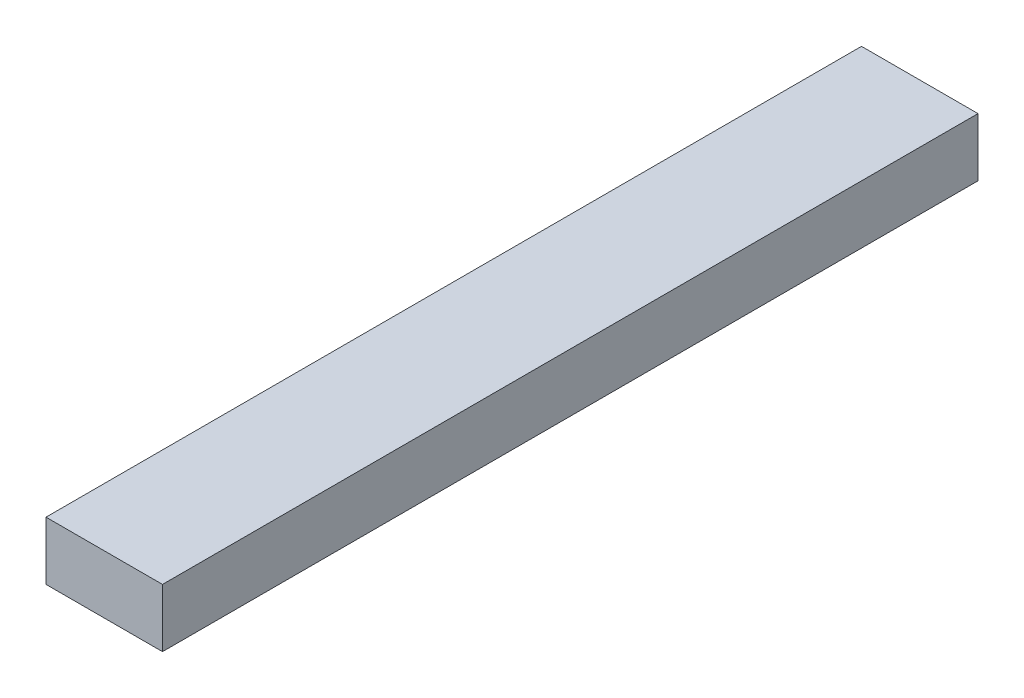
ISO-10303-21;
HEADER;
FILE_DESCRIPTION(('STEP AP214'),'2;1');
FILE_NAME('part.step','',(''),(''),'','','');
FILE_SCHEMA(('AUTOMOTIVE_DESIGN { 1 0 10303 214 1 1 1 1 }'));
ENDSEC;
DATA;
#1=APPLICATION_CONTEXT('core data for automotive mechanical design processes');
#2=APPLICATION_PROTOCOL_DEFINITION('international standard','automotive_design',2000,#1);
#3=PRODUCT_CONTEXT('',#1,'mechanical');
#4=PRODUCT('Part','Part','',(#3));
#5=PRODUCT_RELATED_PRODUCT_CATEGORY('part','',(#4));
#6=PRODUCT_DEFINITION_FORMATION('','',#4);
#7=PRODUCT_DEFINITION_CONTEXT('part definition',#1,'design');
#8=PRODUCT_DEFINITION('design','',#6,#7);
#9=PRODUCT_DEFINITION_SHAPE('','',#8);
#10=(LENGTH_UNIT() NAMED_UNIT(*) SI_UNIT(.MILLI.,.METRE.));
#11=(NAMED_UNIT(*) PLANE_ANGLE_UNIT() SI_UNIT($,.RADIAN.));
#12=(NAMED_UNIT(*) SI_UNIT($,.STERADIAN.) SOLID_ANGLE_UNIT());
#13=UNCERTAINTY_MEASURE_WITH_UNIT(LENGTH_MEASURE(1.E-05),#10,'distance_accuracy_value','');
#14=(GEOMETRIC_REPRESENTATION_CONTEXT(3) GLOBAL_UNCERTAINTY_ASSIGNED_CONTEXT((#13)) GLOBAL_UNIT_ASSIGNED_CONTEXT((#10,
#11,#12)) REPRESENTATION_CONTEXT('',''));
#15=CARTESIAN_POINT('',(0.,0.,0.));
#16=DIRECTION('',(0.,0.,1.));
#17=DIRECTION('',(1.,0.,0.));
#18=AXIS2_PLACEMENT_3D('',#15,#16,#17);
#19=CARTESIAN_POINT('',(50.8,-25.4,914.4));
#20=DIRECTION('',(-1.,0.,0.));
#21=DIRECTION('',(0.,0.,1.));
#22=AXIS2_PLACEMENT_3D('',#19,#20,#21);
#23=PLANE('',#22);
#24=DIRECTION('',(0.,0.,-1.));
#25=VECTOR('',#24,1.);
#26=CARTESIAN_POINT('',(50.8,25.4,914.4));
#27=LINE('',#26,#25);
#28=CARTESIAN_POINT('',(50.8,25.4,812.799999999999));
#29=VERTEX_POINT('',#28);
#30=CARTESIAN_POINT('',(50.8,25.4,101.6));
#31=VERTEX_POINT('',#30);
#32=EDGE_CURVE('E11',#29,#31,#27,.T.);
#33=ORIENTED_EDGE('',*,*,#32,.F.);
#34=DIRECTION('',(0.,1.,0.));
#35=VECTOR('',#34,1.);
#36=CARTESIAN_POINT('',(50.8,-25.4,812.799999999999));
#37=LINE('',#36,#35);
#38=CARTESIAN_POINT('',(50.8,-25.4,812.799999999999));
#39=VERTEX_POINT('',#38);
#40=EDGE_CURVE('E84',#39,#29,#37,.T.);
#41=ORIENTED_EDGE('',*,*,#40,.F.);
#42=DIRECTION('',(0.,0.,-1.));
#43=VECTOR('',#42,1.);
#44=CARTESIAN_POINT('',(50.8,-25.4,914.4));
#45=LINE('',#44,#43);
#46=CARTESIAN_POINT('',(50.8,-25.4,101.6));
#47=VERTEX_POINT('',#46);
#48=EDGE_CURVE('E66',#39,#47,#45,.T.);
#49=ORIENTED_EDGE('',*,*,#48,.T.);
#50=DIRECTION('',(0.,-1.,0.));
#51=VECTOR('',#50,1.);
#52=CARTESIAN_POINT('',(50.8,25.4,101.6));
#53=LINE('',#52,#51);
#54=EDGE_CURVE('E121',#31,#47,#53,.T.);
#55=ORIENTED_EDGE('',*,*,#54,.F.);
#56=EDGE_LOOP('',(#33,#41,#49,#55));
#57=FACE_BOUND('',#56,.T.);
#58=ADVANCED_FACE('F43',(#57),#23,.F.);
#59=CARTESIAN_POINT('',(-50.8,25.4,914.4));
#60=DIRECTION('',(0.,-1.,0.));
#61=DIRECTION('',(0.,0.,-1.));
#62=AXIS2_PLACEMENT_3D('',#59,#60,#61);
#63=PLANE('',#62);
#64=DIRECTION('',(0.,0.,-1.));
#65=VECTOR('',#64,1.);
#66=CARTESIAN_POINT('',(-50.8,25.4,914.4));
#67=LINE('',#66,#65);
#68=CARTESIAN_POINT('',(-50.8,25.4,812.799999999999));
#69=VERTEX_POINT('',#68);
#70=CARTESIAN_POINT('',(-50.8,25.4,101.6));
#71=VERTEX_POINT('',#70);
#72=EDGE_CURVE('E51',#69,#71,#67,.T.);
#73=ORIENTED_EDGE('',*,*,#72,.F.);
#74=DIRECTION('',(-1.,0.,0.));
#75=VECTOR('',#74,1.);
#76=CARTESIAN_POINT('',(-50.8,25.4,812.799999999999));
#77=LINE('',#76,#75);
#78=EDGE_CURVE('E89',#29,#69,#77,.T.);
#79=ORIENTED_EDGE('',*,*,#78,.F.);
#80=ORIENTED_EDGE('',*,*,#32,.T.);
#81=DIRECTION('',(1.,0.,0.));
#82=VECTOR('',#81,1.);
#83=CARTESIAN_POINT('',(-50.8,25.4,101.6));
#84=LINE('',#83,#82);
#85=EDGE_CURVE('E118',#71,#31,#84,.T.);
#86=ORIENTED_EDGE('',*,*,#85,.F.);
#87=EDGE_LOOP('',(#73,#79,#80,#86));
#88=FACE_BOUND('',#87,.T.);
#89=ADVANCED_FACE('F119',(#88),#63,.F.);
#90=CARTESIAN_POINT('',(-50.8,-25.4,914.4));
#91=DIRECTION('',(1.,0.,0.));
#92=DIRECTION('',(0.,0.,-1.));
#93=AXIS2_PLACEMENT_3D('',#90,#91,#92);
#94=PLANE('',#93);
#95=DIRECTION('',(0.,0.,-1.));
#96=VECTOR('',#95,1.);
#97=CARTESIAN_POINT('',(-50.8,-25.4,914.4));
#98=LINE('',#97,#96);
#99=CARTESIAN_POINT('',(-50.8,-25.4,812.799999999999));
#100=VERTEX_POINT('',#99);
#101=CARTESIAN_POINT('',(-50.8,-25.4,101.6));
#102=VERTEX_POINT('',#101);
#103=EDGE_CURVE('E99',#100,#102,#98,.T.);
#104=ORIENTED_EDGE('',*,*,#103,.F.);
#105=DIRECTION('',(0.,1.,0.));
#106=VECTOR('',#105,1.);
#107=CARTESIAN_POINT('',(-50.8,-25.4,812.799999999999));
#108=LINE('',#107,#106);
#109=EDGE_CURVE('E58',#100,#69,#108,.T.);
#110=ORIENTED_EDGE('',*,*,#109,.T.);
#111=ORIENTED_EDGE('',*,*,#72,.T.);
#112=DIRECTION('',(0.,1.,0.));
#113=VECTOR('',#112,1.);
#114=CARTESIAN_POINT('',(-50.8,-25.4,101.6));
#115=LINE('',#114,#113);
#116=EDGE_CURVE('E100',#102,#71,#115,.T.);
#117=ORIENTED_EDGE('',*,*,#116,.F.);
#118=EDGE_LOOP('',(#104,#110,#111,#117));
#119=FACE_BOUND('',#118,.T.);
#120=ADVANCED_FACE('F112',(#119),#94,.F.);
#121=CARTESIAN_POINT('',(-50.8,-25.4,914.4));
#122=DIRECTION('',(0.,1.,0.));
#123=DIRECTION('',(0.,0.,1.));
#124=AXIS2_PLACEMENT_3D('',#121,#122,#123);
#125=PLANE('',#124);
#126=ORIENTED_EDGE('',*,*,#48,.F.);
#127=DIRECTION('',(-1.,0.,0.));
#128=VECTOR('',#127,1.);
#129=CARTESIAN_POINT('',(-50.8,-25.4,812.799999999999));
#130=LINE('',#129,#128);
#131=EDGE_CURVE('E82',#39,#100,#130,.T.);
#132=ORIENTED_EDGE('',*,*,#131,.T.);
#133=ORIENTED_EDGE('',*,*,#103,.T.);
#134=DIRECTION('',(-1.,0.,0.));
#135=VECTOR('',#134,1.);
#136=CARTESIAN_POINT('',(50.8,-25.4,101.6));
#137=LINE('',#136,#135);
#138=EDGE_CURVE('E97',#47,#102,#137,.T.);
#139=ORIENTED_EDGE('',*,*,#138,.F.);
#140=EDGE_LOOP('',(#126,#132,#133,#139));
#141=FACE_BOUND('',#140,.T.);
#142=ADVANCED_FACE('F95',(#141),#125,.F.);
#143=CARTESIAN_POINT('',(0.,0.,101.6));
#144=DIRECTION('',(0.,0.,-1.));
#145=DIRECTION('',(-1.,0.,0.));
#146=AXIS2_PLACEMENT_3D('',#143,#144,#145);
#147=PLANE('',#146);
#148=ORIENTED_EDGE('',*,*,#85,.T.);
#149=ORIENTED_EDGE('',*,*,#54,.T.);
#150=ORIENTED_EDGE('',*,*,#138,.T.);
#151=ORIENTED_EDGE('',*,*,#116,.T.);
#152=EDGE_LOOP('',(#148,#149,#150,#151));
#153=FACE_BOUND('',#152,.T.);
#154=ADVANCED_FACE('F117',(#153),#147,.T.);
#155=CARTESIAN_POINT('',(-50.8,-25.4,812.799999999999));
#156=DIRECTION('',(0.,0.,-1.));
#157=DIRECTION('',(-1.,0.,0.));
#158=AXIS2_PLACEMENT_3D('',#155,#156,#157);
#159=PLANE('',#158);
#160=ORIENTED_EDGE('',*,*,#78,.T.);
#161=ORIENTED_EDGE('',*,*,#109,.F.);
#162=ORIENTED_EDGE('',*,*,#131,.F.);
#163=ORIENTED_EDGE('',*,*,#40,.T.);
#164=EDGE_LOOP('',(#160,#161,#162,#163));
#165=FACE_BOUND('',#164,.T.);
#166=ADVANCED_FACE('F83',(#165),#159,.F.);
#167=CLOSED_SHELL('',(#58,#89,#120,#142,#154,#166));
#168=MANIFOLD_SOLID_BREP('B2',#167);
#169=ADVANCED_BREP_SHAPE_REPRESENTATION('',(#18,#168),#14);
#170=SHAPE_DEFINITION_REPRESENTATION(#9,#169);
ENDSEC;
END-ISO-10303-21;
